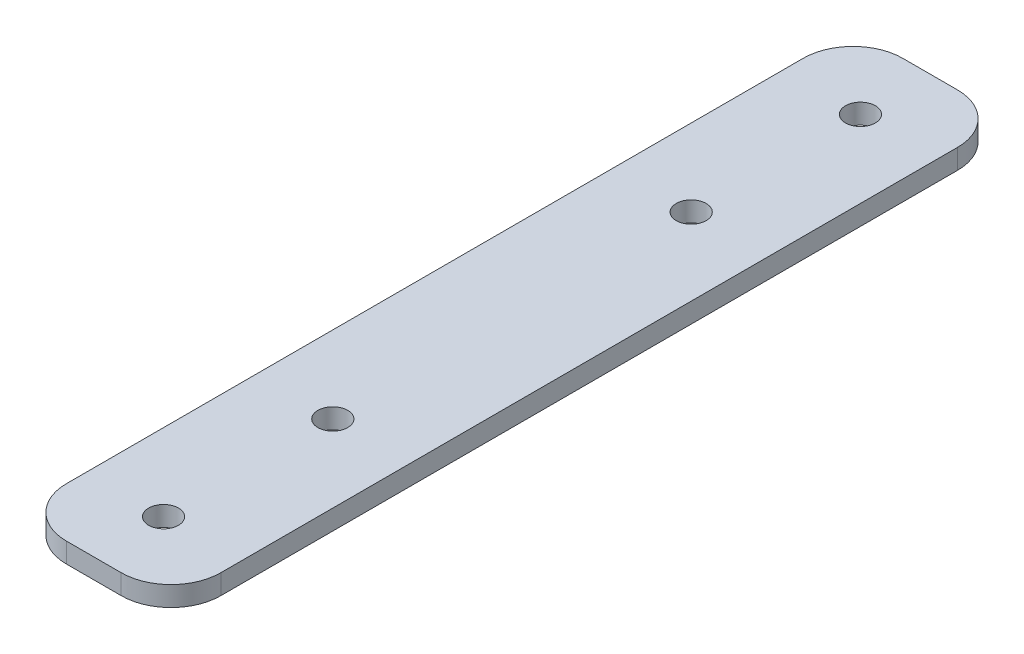
ISO-10303-21;
HEADER;
FILE_DESCRIPTION(('STEP AP214'),'2;1');
FILE_NAME('part.step','',(''),(''),'','','');
FILE_SCHEMA(('AUTOMOTIVE_DESIGN { 1 0 10303 214 1 1 1 1 }'));
ENDSEC;
DATA;
#1=APPLICATION_CONTEXT('core data for automotive mechanical design processes');
#2=APPLICATION_PROTOCOL_DEFINITION('international standard','automotive_design',2000,#1);
#3=PRODUCT_CONTEXT('',#1,'mechanical');
#4=PRODUCT('Part','Part','',(#3));
#5=PRODUCT_RELATED_PRODUCT_CATEGORY('part','',(#4));
#6=PRODUCT_DEFINITION_FORMATION('','',#4);
#7=PRODUCT_DEFINITION_CONTEXT('part definition',#1,'design');
#8=PRODUCT_DEFINITION('design','',#6,#7);
#9=PRODUCT_DEFINITION_SHAPE('','',#8);
#10=(LENGTH_UNIT() NAMED_UNIT(*) SI_UNIT(.MILLI.,.METRE.));
#11=(NAMED_UNIT(*) PLANE_ANGLE_UNIT() SI_UNIT($,.RADIAN.));
#12=(NAMED_UNIT(*) SI_UNIT($,.STERADIAN.) SOLID_ANGLE_UNIT());
#13=UNCERTAINTY_MEASURE_WITH_UNIT(LENGTH_MEASURE(1.E-05),#10,'distance_accuracy_value','');
#14=(GEOMETRIC_REPRESENTATION_CONTEXT(3) GLOBAL_UNCERTAINTY_ASSIGNED_CONTEXT((#13)) GLOBAL_UNIT_ASSIGNED_CONTEXT((#10,
#11,#12)) REPRESENTATION_CONTEXT('',''));
#15=CARTESIAN_POINT('',(0.,0.,0.));
#16=DIRECTION('',(0.,0.,1.));
#17=DIRECTION('',(1.,0.,0.));
#18=AXIS2_PLACEMENT_3D('',#15,#16,#17);
#19=CARTESIAN_POINT('',(0.,0.,84.));
#20=DIRECTION('',(0.,1.,0.));
#21=DIRECTION('',(0.,0.,1.));
#22=AXIS2_PLACEMENT_3D('',#19,#20,#21);
#23=PLANE('',#22);
#24=CARTESIAN_POINT('',(7.75,0.,7.));
#25=DIRECTION('',(0.,1.,0.));
#26=DIRECTION('',(0.,0.,1.));
#27=AXIS2_PLACEMENT_3D('',#24,#25,#26);
#28=CIRCLE('',#27,1.5);
#29=CARTESIAN_POINT('',(7.75,0.,8.5));
#30=VERTEX_POINT('',#29);
#31=EDGE_CURVE('E170',#30,#30,#28,.T.);
#32=ORIENTED_EDGE('',*,*,#31,.T.);
#33=EDGE_LOOP('',(#32));
#34=FACE_BOUND('',#33,.T.);
#35=CARTESIAN_POINT('',(7.75,0.,77.));
#36=DIRECTION('',(0.,1.,0.));
#37=DIRECTION('',(0.,0.,-1.));
#38=AXIS2_PLACEMENT_3D('',#35,#36,#37);
#39=CIRCLE('',#38,1.5);
#40=CARTESIAN_POINT('',(7.75,0.,75.5));
#41=VERTEX_POINT('',#40);
#42=EDGE_CURVE('E176',#41,#41,#39,.T.);
#43=ORIENTED_EDGE('',*,*,#42,.T.);
#44=EDGE_LOOP('',(#43));
#45=FACE_BOUND('',#44,.T.);
#46=CARTESIAN_POINT('',(7.75,0.,60.));
#47=DIRECTION('',(0.,1.,0.));
#48=DIRECTION('',(0.,0.,-1.));
#49=AXIS2_PLACEMENT_3D('',#46,#47,#48);
#50=CIRCLE('',#49,1.5);
#51=CARTESIAN_POINT('',(7.75,0.,58.5));
#52=VERTEX_POINT('',#51);
#53=EDGE_CURVE('E177',#52,#52,#50,.T.);
#54=ORIENTED_EDGE('',*,*,#53,.T.);
#55=EDGE_LOOP('',(#54));
#56=FACE_BOUND('',#55,.T.);
#57=CARTESIAN_POINT('',(7.75,0.,24.));
#58=DIRECTION('',(0.,1.,0.));
#59=DIRECTION('',(0.,0.,1.));
#60=AXIS2_PLACEMENT_3D('',#57,#58,#59);
#61=CIRCLE('',#60,1.5);
#62=CARTESIAN_POINT('',(7.75,0.,25.5));
#63=VERTEX_POINT('',#62);
#64=EDGE_CURVE('E116',#63,#63,#61,.T.);
#65=ORIENTED_EDGE('',*,*,#64,.T.);
#66=EDGE_LOOP('',(#65));
#67=FACE_BOUND('',#66,.T.);
#68=DIRECTION('',(0.,0.,-1.));
#69=VECTOR('',#68,1.);
#70=CARTESIAN_POINT('',(0.,0.,84.));
#71=LINE('',#70,#69);
#72=CARTESIAN_POINT('',(0.,0.,79.));
#73=VERTEX_POINT('',#72);
#74=CARTESIAN_POINT('',(0.,0.,5.00000000000003));
#75=VERTEX_POINT('',#74);
#76=EDGE_CURVE('E100',#73,#75,#71,.T.);
#77=ORIENTED_EDGE('',*,*,#76,.T.);
#78=CARTESIAN_POINT('',(5.,0.,5.));
#79=DIRECTION('',(0.,1.,0.));
#80=DIRECTION('',(0.,0.,1.));
#81=AXIS2_PLACEMENT_3D('',#78,#79,#80);
#82=CIRCLE('',#81,5.);
#83=CARTESIAN_POINT('',(5.,0.,0.));
#84=VERTEX_POINT('',#83);
#85=EDGE_CURVE('E96',#75,#84,#82,.F.);
#86=ORIENTED_EDGE('',*,*,#85,.T.);
#87=DIRECTION('',(1.,0.,0.));
#88=VECTOR('',#87,1.);
#89=CARTESIAN_POINT('',(0.,0.,0.));
#90=LINE('',#89,#88);
#91=CARTESIAN_POINT('',(10.5,0.,0.));
#92=VERTEX_POINT('',#91);
#93=EDGE_CURVE('E98',#84,#92,#90,.T.);
#94=ORIENTED_EDGE('',*,*,#93,.T.);
#95=CARTESIAN_POINT('',(10.5,0.,5.));
#96=DIRECTION('',(0.,1.,0.));
#97=DIRECTION('',(0.,0.,1.));
#98=AXIS2_PLACEMENT_3D('',#95,#96,#97);
#99=CIRCLE('',#98,5.);
#100=CARTESIAN_POINT('',(15.5,0.,5.00000000000003));
#101=VERTEX_POINT('',#100);
#102=EDGE_CURVE('E139',#92,#101,#99,.F.);
#103=ORIENTED_EDGE('',*,*,#102,.T.);
#104=DIRECTION('',(0.,0.,-1.));
#105=VECTOR('',#104,1.);
#106=CARTESIAN_POINT('',(15.5,0.,84.));
#107=LINE('',#106,#105);
#108=CARTESIAN_POINT('',(15.5,0.,79.));
#109=VERTEX_POINT('',#108);
#110=EDGE_CURVE('E124',#109,#101,#107,.T.);
#111=ORIENTED_EDGE('',*,*,#110,.F.);
#112=CARTESIAN_POINT('',(10.5,0.,79.));
#113=DIRECTION('',(0.,1.,0.));
#114=DIRECTION('',(0.,0.,1.));
#115=AXIS2_PLACEMENT_3D('',#112,#113,#114);
#116=CIRCLE('',#115,5.);
#117=CARTESIAN_POINT('',(10.5,0.,84.));
#118=VERTEX_POINT('',#117);
#119=EDGE_CURVE('E47',#109,#118,#116,.F.);
#120=ORIENTED_EDGE('',*,*,#119,.T.);
#121=DIRECTION('',(1.,0.,0.));
#122=VECTOR('',#121,1.);
#123=CARTESIAN_POINT('',(0.,0.,84.));
#124=LINE('',#123,#122);
#125=CARTESIAN_POINT('',(5.,0.,84.));
#126=VERTEX_POINT('',#125);
#127=EDGE_CURVE('E162',#126,#118,#124,.T.);
#128=ORIENTED_EDGE('',*,*,#127,.F.);
#129=CARTESIAN_POINT('',(5.,0.,79.));
#130=DIRECTION('',(0.,1.,0.));
#131=DIRECTION('',(0.,0.,1.));
#132=AXIS2_PLACEMENT_3D('',#129,#130,#131);
#133=CIRCLE('',#132,5.);
#134=EDGE_CURVE('E137',#126,#73,#133,.F.);
#135=ORIENTED_EDGE('',*,*,#134,.T.);
#136=EDGE_LOOP('',(#77,#86,#94,#103,#111,#120,#128,#135));
#137=FACE_BOUND('',#136,.T.);
#138=ADVANCED_FACE('F32',(#34,#45,#56,#67,#137),#23,.F.);
#139=CARTESIAN_POINT('',(15.5,2.,84.));
#140=DIRECTION('',(1.,0.,0.));
#141=DIRECTION('',(0.,0.,-1.));
#142=AXIS2_PLACEMENT_3D('',#139,#140,#141);
#143=PLANE('',#142);
#144=DIRECTION('',(0.,0.,-1.));
#145=VECTOR('',#144,1.);
#146=CARTESIAN_POINT('',(15.5,2.,84.));
#147=LINE('',#146,#145);
#148=CARTESIAN_POINT('',(15.5,2.,79.));
#149=VERTEX_POINT('',#148);
#150=CARTESIAN_POINT('',(15.5,2.,5.00000000000003));
#151=VERTEX_POINT('',#150);
#152=EDGE_CURVE('E152',#149,#151,#147,.T.);
#153=ORIENTED_EDGE('',*,*,#152,.F.);
#154=DIRECTION('',(0.,-1.,0.));
#155=VECTOR('',#154,1.);
#156=CARTESIAN_POINT('',(15.5,0.,79.));
#157=LINE('',#156,#155);
#158=EDGE_CURVE('E143',#149,#109,#157,.T.);
#159=ORIENTED_EDGE('',*,*,#158,.T.);
#160=ORIENTED_EDGE('',*,*,#110,.T.);
#161=DIRECTION('',(0.,-1.,0.));
#162=VECTOR('',#161,1.);
#163=CARTESIAN_POINT('',(15.5,2.,5.));
#164=LINE('',#163,#162);
#165=EDGE_CURVE('E104',#101,#151,#164,.F.);
#166=ORIENTED_EDGE('',*,*,#165,.T.);
#167=EDGE_LOOP('',(#153,#159,#160,#166));
#168=FACE_BOUND('',#167,.T.);
#169=ADVANCED_FACE('F149',(#168),#143,.T.);
#170=CARTESIAN_POINT('',(0.,2.,84.));
#171=DIRECTION('',(0.,1.,0.));
#172=DIRECTION('',(0.,0.,1.));
#173=AXIS2_PLACEMENT_3D('',#170,#171,#172);
#174=PLANE('',#173);
#175=CARTESIAN_POINT('',(7.75,2.,7.));
#176=DIRECTION('',(0.,1.,0.));
#177=DIRECTION('',(0.,0.,1.));
#178=AXIS2_PLACEMENT_3D('',#175,#176,#177);
#179=CIRCLE('',#178,1.5);
#180=CARTESIAN_POINT('',(7.75,2.,8.5));
#181=VERTEX_POINT('',#180);
#182=EDGE_CURVE('E180',#181,#181,#179,.T.);
#183=ORIENTED_EDGE('',*,*,#182,.F.);
#184=EDGE_LOOP('',(#183));
#185=FACE_BOUND('',#184,.T.);
#186=CARTESIAN_POINT('',(7.75,2.,77.));
#187=DIRECTION('',(0.,1.,0.));
#188=DIRECTION('',(0.,0.,-1.));
#189=AXIS2_PLACEMENT_3D('',#186,#187,#188);
#190=CIRCLE('',#189,1.5);
#191=CARTESIAN_POINT('',(7.75,2.,75.5));
#192=VERTEX_POINT('',#191);
#193=EDGE_CURVE('E173',#192,#192,#190,.T.);
#194=ORIENTED_EDGE('',*,*,#193,.F.);
#195=EDGE_LOOP('',(#194));
#196=FACE_BOUND('',#195,.T.);
#197=CARTESIAN_POINT('',(7.75,2.,60.));
#198=DIRECTION('',(0.,1.,0.));
#199=DIRECTION('',(0.,0.,-1.));
#200=AXIS2_PLACEMENT_3D('',#197,#198,#199);
#201=CIRCLE('',#200,1.5);
#202=CARTESIAN_POINT('',(7.75,2.,58.5));
#203=VERTEX_POINT('',#202);
#204=EDGE_CURVE('E185',#203,#203,#201,.T.);
#205=ORIENTED_EDGE('',*,*,#204,.F.);
#206=EDGE_LOOP('',(#205));
#207=FACE_BOUND('',#206,.T.);
#208=CARTESIAN_POINT('',(7.75,2.,24.));
#209=DIRECTION('',(0.,1.,0.));
#210=DIRECTION('',(0.,0.,1.));
#211=AXIS2_PLACEMENT_3D('',#208,#209,#210);
#212=CIRCLE('',#211,1.5);
#213=CARTESIAN_POINT('',(7.75,2.,25.5));
#214=VERTEX_POINT('',#213);
#215=EDGE_CURVE('E167',#214,#214,#212,.T.);
#216=ORIENTED_EDGE('',*,*,#215,.F.);
#217=EDGE_LOOP('',(#216));
#218=FACE_BOUND('',#217,.T.);
#219=DIRECTION('',(1.,0.,0.));
#220=VECTOR('',#219,1.);
#221=CARTESIAN_POINT('',(0.,2.,0.));
#222=LINE('',#221,#220);
#223=CARTESIAN_POINT('',(5.,2.,0.));
#224=VERTEX_POINT('',#223);
#225=CARTESIAN_POINT('',(10.5,2.,0.));
#226=VERTEX_POINT('',#225);
#227=EDGE_CURVE('E115',#224,#226,#222,.T.);
#228=ORIENTED_EDGE('',*,*,#227,.F.);
#229=CARTESIAN_POINT('',(5.,2.,5.));
#230=DIRECTION('',(0.,1.,0.));
#231=DIRECTION('',(0.,0.,1.));
#232=AXIS2_PLACEMENT_3D('',#229,#230,#231);
#233=CIRCLE('',#232,5.);
#234=CARTESIAN_POINT('',(0.,2.,5.00000000000003));
#235=VERTEX_POINT('',#234);
#236=EDGE_CURVE('E119',#224,#235,#233,.T.);
#237=ORIENTED_EDGE('',*,*,#236,.T.);
#238=DIRECTION('',(0.,0.,-1.));
#239=VECTOR('',#238,1.);
#240=CARTESIAN_POINT('',(0.,2.,84.));
#241=LINE('',#240,#239);
#242=CARTESIAN_POINT('',(0.,2.,79.));
#243=VERTEX_POINT('',#242);
#244=EDGE_CURVE('E155',#243,#235,#241,.T.);
#245=ORIENTED_EDGE('',*,*,#244,.F.);
#246=CARTESIAN_POINT('',(5.,2.,79.));
#247=DIRECTION('',(0.,1.,0.));
#248=DIRECTION('',(0.,0.,1.));
#249=AXIS2_PLACEMENT_3D('',#246,#247,#248);
#250=CIRCLE('',#249,5.);
#251=CARTESIAN_POINT('',(5.,2.,84.));
#252=VERTEX_POINT('',#251);
#253=EDGE_CURVE('E120',#243,#252,#250,.T.);
#254=ORIENTED_EDGE('',*,*,#253,.T.);
#255=DIRECTION('',(1.,0.,0.));
#256=VECTOR('',#255,1.);
#257=CARTESIAN_POINT('',(0.,2.,84.));
#258=LINE('',#257,#256);
#259=CARTESIAN_POINT('',(10.5,2.,84.));
#260=VERTEX_POINT('',#259);
#261=EDGE_CURVE('E161',#252,#260,#258,.T.);
#262=ORIENTED_EDGE('',*,*,#261,.T.);
#263=CARTESIAN_POINT('',(10.5,2.,79.));
#264=DIRECTION('',(0.,1.,0.));
#265=DIRECTION('',(0.,0.,1.));
#266=AXIS2_PLACEMENT_3D('',#263,#264,#265);
#267=CIRCLE('',#266,5.);
#268=EDGE_CURVE('E129',#260,#149,#267,.T.);
#269=ORIENTED_EDGE('',*,*,#268,.T.);
#270=ORIENTED_EDGE('',*,*,#152,.T.);
#271=CARTESIAN_POINT('',(10.5,2.,5.));
#272=DIRECTION('',(0.,1.,0.));
#273=DIRECTION('',(0.,0.,1.));
#274=AXIS2_PLACEMENT_3D('',#271,#272,#273);
#275=CIRCLE('',#274,5.);
#276=EDGE_CURVE('E122',#151,#226,#275,.T.);
#277=ORIENTED_EDGE('',*,*,#276,.T.);
#278=EDGE_LOOP('',(#228,#237,#245,#254,#262,#269,#270,#277));
#279=FACE_BOUND('',#278,.T.);
#280=ADVANCED_FACE('F201',(#185,#196,#207,#218,#279),#174,.T.);
#281=CARTESIAN_POINT('',(0.,0.,84.));
#282=DIRECTION('',(-1.,0.,0.));
#283=DIRECTION('',(0.,0.,1.));
#284=AXIS2_PLACEMENT_3D('',#281,#282,#283);
#285=PLANE('',#284);
#286=ORIENTED_EDGE('',*,*,#244,.T.);
#287=DIRECTION('',(0.,1.,0.));
#288=VECTOR('',#287,1.);
#289=CARTESIAN_POINT('',(0.,0.,5.));
#290=LINE('',#289,#288);
#291=EDGE_CURVE('E135',#235,#75,#290,.F.);
#292=ORIENTED_EDGE('',*,*,#291,.T.);
#293=ORIENTED_EDGE('',*,*,#76,.F.);
#294=DIRECTION('',(0.,1.,0.));
#295=VECTOR('',#294,1.);
#296=CARTESIAN_POINT('',(0.,2.,79.));
#297=LINE('',#296,#295);
#298=EDGE_CURVE('E132',#73,#243,#297,.T.);
#299=ORIENTED_EDGE('',*,*,#298,.T.);
#300=EDGE_LOOP('',(#286,#292,#293,#299));
#301=FACE_BOUND('',#300,.T.);
#302=ADVANCED_FACE('F204',(#301),#285,.T.);
#303=CARTESIAN_POINT('',(0.,0.,84.));
#304=DIRECTION('',(0.,0.,-1.));
#305=DIRECTION('',(-1.,0.,0.));
#306=AXIS2_PLACEMENT_3D('',#303,#304,#305);
#307=PLANE('',#306);
#308=ORIENTED_EDGE('',*,*,#127,.T.);
#309=DIRECTION('',(0.,-1.,0.));
#310=VECTOR('',#309,1.);
#311=CARTESIAN_POINT('',(10.5,2.,84.));
#312=LINE('',#311,#310);
#313=EDGE_CURVE('E11',#118,#260,#312,.F.);
#314=ORIENTED_EDGE('',*,*,#313,.T.);
#315=ORIENTED_EDGE('',*,*,#261,.F.);
#316=DIRECTION('',(0.,1.,0.));
#317=VECTOR('',#316,1.);
#318=CARTESIAN_POINT('',(5.,0.,84.));
#319=LINE('',#318,#317);
#320=EDGE_CURVE('E40',#252,#126,#319,.F.);
#321=ORIENTED_EDGE('',*,*,#320,.T.);
#322=EDGE_LOOP('',(#308,#314,#315,#321));
#323=FACE_BOUND('',#322,.T.);
#324=ADVANCED_FACE('F215',(#323),#307,.F.);
#325=CARTESIAN_POINT('',(0.,0.,0.));
#326=DIRECTION('',(0.,0.,-1.));
#327=DIRECTION('',(-1.,0.,0.));
#328=AXIS2_PLACEMENT_3D('',#325,#326,#327);
#329=PLANE('',#328);
#330=ORIENTED_EDGE('',*,*,#93,.F.);
#331=DIRECTION('',(0.,1.,0.));
#332=VECTOR('',#331,1.);
#333=CARTESIAN_POINT('',(5.,0.,0.));
#334=LINE('',#333,#332);
#335=EDGE_CURVE('E111',#84,#224,#334,.T.);
#336=ORIENTED_EDGE('',*,*,#335,.T.);
#337=ORIENTED_EDGE('',*,*,#227,.T.);
#338=DIRECTION('',(0.,-1.,0.));
#339=VECTOR('',#338,1.);
#340=CARTESIAN_POINT('',(10.5,0.,0.));
#341=LINE('',#340,#339);
#342=EDGE_CURVE('E114',#226,#92,#341,.T.);
#343=ORIENTED_EDGE('',*,*,#342,.T.);
#344=EDGE_LOOP('',(#330,#336,#337,#343));
#345=FACE_BOUND('',#344,.T.);
#346=ADVANCED_FACE('F109',(#345),#329,.T.);
#347=CARTESIAN_POINT('',(7.75,0.,24.));
#348=DIRECTION('',(0.,1.,0.));
#349=DIRECTION('',(0.,0.,1.));
#350=AXIS2_PLACEMENT_3D('',#347,#348,#349);
#351=CYLINDRICAL_SURFACE('',#350,1.5);
#352=ORIENTED_EDGE('',*,*,#64,.F.);
#353=EDGE_LOOP('',(#352));
#354=FACE_BOUND('',#353,.T.);
#355=ORIENTED_EDGE('',*,*,#215,.T.);
#356=EDGE_LOOP('',(#355));
#357=FACE_BOUND('',#356,.T.);
#358=ADVANCED_FACE('F197',(#354,#357),#351,.F.);
#359=CARTESIAN_POINT('',(7.75,0.,60.));
#360=DIRECTION('',(0.,1.,0.));
#361=DIRECTION('',(0.,0.,1.));
#362=AXIS2_PLACEMENT_3D('',#359,#360,#361);
#363=CYLINDRICAL_SURFACE('',#362,1.5);
#364=ORIENTED_EDGE('',*,*,#53,.F.);
#365=EDGE_LOOP('',(#364));
#366=FACE_BOUND('',#365,.T.);
#367=ORIENTED_EDGE('',*,*,#204,.T.);
#368=EDGE_LOOP('',(#367));
#369=FACE_BOUND('',#368,.T.);
#370=ADVANCED_FACE('F193',(#366,#369),#363,.F.);
#371=CARTESIAN_POINT('',(7.75,0.,77.));
#372=DIRECTION('',(0.,1.,0.));
#373=DIRECTION('',(0.,0.,1.));
#374=AXIS2_PLACEMENT_3D('',#371,#372,#373);
#375=CYLINDRICAL_SURFACE('',#374,1.5);
#376=ORIENTED_EDGE('',*,*,#42,.F.);
#377=EDGE_LOOP('',(#376));
#378=FACE_BOUND('',#377,.T.);
#379=ORIENTED_EDGE('',*,*,#193,.T.);
#380=EDGE_LOOP('',(#379));
#381=FACE_BOUND('',#380,.T.);
#382=ADVANCED_FACE('F196',(#378,#381),#375,.F.);
#383=CARTESIAN_POINT('',(7.75,0.,7.));
#384=DIRECTION('',(0.,1.,0.));
#385=DIRECTION('',(0.,0.,1.));
#386=AXIS2_PLACEMENT_3D('',#383,#384,#385);
#387=CYLINDRICAL_SURFACE('',#386,1.5);
#388=ORIENTED_EDGE('',*,*,#31,.F.);
#389=EDGE_LOOP('',(#388));
#390=FACE_BOUND('',#389,.T.);
#391=ORIENTED_EDGE('',*,*,#182,.T.);
#392=EDGE_LOOP('',(#391));
#393=FACE_BOUND('',#392,.T.);
#394=ADVANCED_FACE('F238',(#390,#393),#387,.F.);
#395=CARTESIAN_POINT('',(5.,0.,5.));
#396=DIRECTION('',(0.,1.,0.));
#397=DIRECTION('',(0.,0.,1.));
#398=AXIS2_PLACEMENT_3D('',#395,#396,#397);
#399=CYLINDRICAL_SURFACE('',#398,5.);
#400=ORIENTED_EDGE('',*,*,#85,.F.);
#401=ORIENTED_EDGE('',*,*,#291,.F.);
#402=ORIENTED_EDGE('',*,*,#236,.F.);
#403=ORIENTED_EDGE('',*,*,#335,.F.);
#404=EDGE_LOOP('',(#400,#401,#402,#403));
#405=FACE_BOUND('',#404,.T.);
#406=ADVANCED_FACE('F118',(#405),#399,.T.);
#407=CARTESIAN_POINT('',(10.5,2.,79.));
#408=DIRECTION('',(0.,1.,0.));
#409=DIRECTION('',(0.,0.,1.));
#410=AXIS2_PLACEMENT_3D('',#407,#408,#409);
#411=CYLINDRICAL_SURFACE('',#410,5.);
#412=ORIENTED_EDGE('',*,*,#268,.F.);
#413=ORIENTED_EDGE('',*,*,#313,.F.);
#414=ORIENTED_EDGE('',*,*,#119,.F.);
#415=ORIENTED_EDGE('',*,*,#158,.F.);
#416=EDGE_LOOP('',(#412,#413,#414,#415));
#417=FACE_BOUND('',#416,.T.);
#418=ADVANCED_FACE('F214',(#417),#411,.T.);
#419=CARTESIAN_POINT('',(10.5,0.,5.));
#420=DIRECTION('',(0.,-1.,0.));
#421=DIRECTION('',(0.,0.,-1.));
#422=AXIS2_PLACEMENT_3D('',#419,#420,#421);
#423=CYLINDRICAL_SURFACE('',#422,5.);
#424=ORIENTED_EDGE('',*,*,#276,.F.);
#425=ORIENTED_EDGE('',*,*,#165,.F.);
#426=ORIENTED_EDGE('',*,*,#102,.F.);
#427=ORIENTED_EDGE('',*,*,#342,.F.);
#428=EDGE_LOOP('',(#424,#425,#426,#427));
#429=FACE_BOUND('',#428,.T.);
#430=ADVANCED_FACE('F212',(#429),#423,.T.);
#431=CARTESIAN_POINT('',(5.,0.,79.));
#432=DIRECTION('',(0.,-1.,0.));
#433=DIRECTION('',(0.,0.,-1.));
#434=AXIS2_PLACEMENT_3D('',#431,#432,#433);
#435=CYLINDRICAL_SURFACE('',#434,5.);
#436=ORIENTED_EDGE('',*,*,#134,.F.);
#437=ORIENTED_EDGE('',*,*,#320,.F.);
#438=ORIENTED_EDGE('',*,*,#253,.F.);
#439=ORIENTED_EDGE('',*,*,#298,.F.);
#440=EDGE_LOOP('',(#436,#437,#438,#439));
#441=FACE_BOUND('',#440,.T.);
#442=ADVANCED_FACE('F34',(#441),#435,.T.);
#443=CLOSED_SHELL('',(#138,#169,#280,#302,#324,#346,#358,#370,#382,#394,#406,#418,#430,#442));
#444=MANIFOLD_SOLID_BREP('B2',#443);
#445=ADVANCED_BREP_SHAPE_REPRESENTATION('',(#18,#444),#14);
#446=SHAPE_DEFINITION_REPRESENTATION(#9,#445);
ENDSEC;
END-ISO-10303-21;
